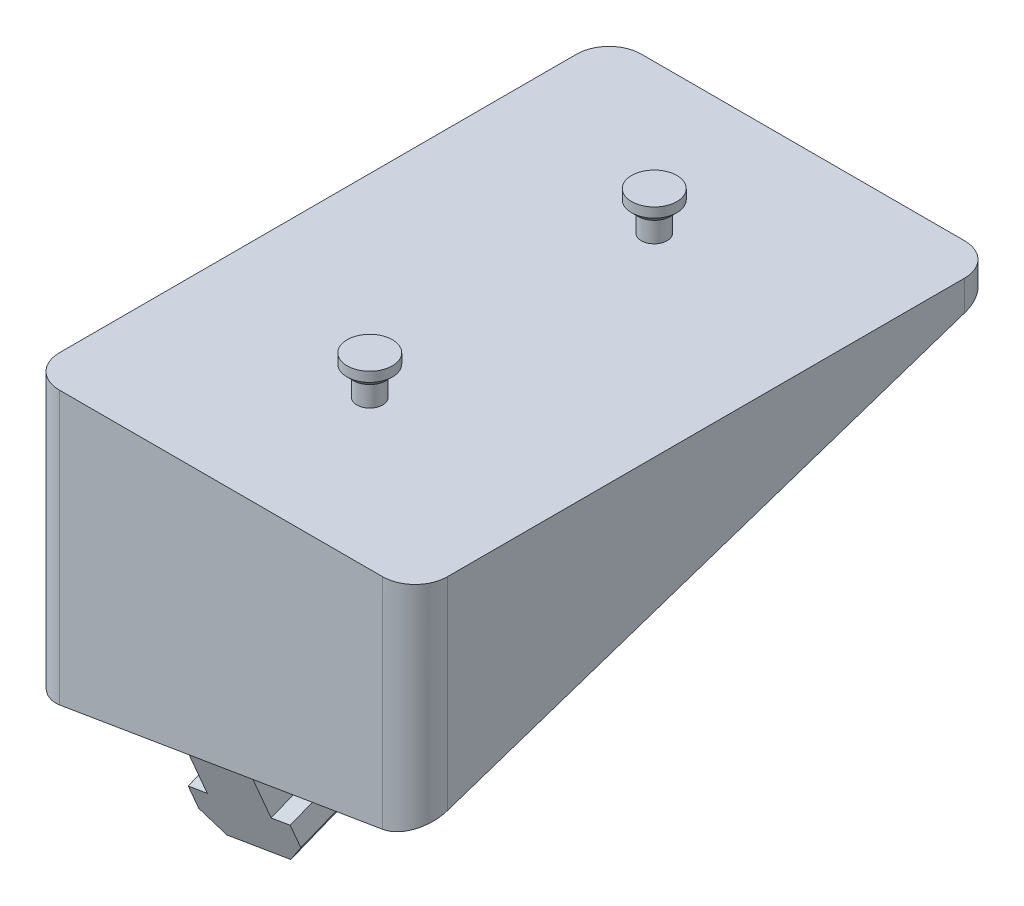
ISO-10303-21;
HEADER;
FILE_DESCRIPTION(('STEP AP214'),'2;1');
FILE_NAME('part.step','',(''),(''),'','','');
FILE_SCHEMA(('AUTOMOTIVE_DESIGN { 1 0 10303 214 1 1 1 1 }'));
ENDSEC;
DATA;
#1=APPLICATION_CONTEXT('core data for automotive mechanical design processes');
#2=APPLICATION_PROTOCOL_DEFINITION('international standard','automotive_design',2000,#1);
#3=PRODUCT_CONTEXT('',#1,'mechanical');
#4=PRODUCT('Part','Part','',(#3));
#5=PRODUCT_RELATED_PRODUCT_CATEGORY('part','',(#4));
#6=PRODUCT_DEFINITION_FORMATION('','',#4);
#7=PRODUCT_DEFINITION_CONTEXT('part definition',#1,'design');
#8=PRODUCT_DEFINITION('design','',#6,#7);
#9=PRODUCT_DEFINITION_SHAPE('','',#8);
#10=(LENGTH_UNIT() NAMED_UNIT(*) SI_UNIT(.MILLI.,.METRE.));
#11=(NAMED_UNIT(*) PLANE_ANGLE_UNIT() SI_UNIT($,.RADIAN.));
#12=(NAMED_UNIT(*) SI_UNIT($,.STERADIAN.) SOLID_ANGLE_UNIT());
#13=UNCERTAINTY_MEASURE_WITH_UNIT(LENGTH_MEASURE(1.E-05),#10,'distance_accuracy_value','');
#14=(GEOMETRIC_REPRESENTATION_CONTEXT(3) GLOBAL_UNCERTAINTY_ASSIGNED_CONTEXT((#13)) GLOBAL_UNIT_ASSIGNED_CONTEXT((#10,
#11,#12)) REPRESENTATION_CONTEXT('',''));
#15=CARTESIAN_POINT('',(0.,0.,0.));
#16=DIRECTION('',(0.,0.,1.));
#17=DIRECTION('',(1.,0.,0.));
#18=AXIS2_PLACEMENT_3D('',#15,#16,#17);
#19=CARTESIAN_POINT('',(1.75609756097561,-10.5365853658537,-3.51219512195122));
#20=DIRECTION('',(0.156173761888606,-0.937042571331637,-0.312347523777212));
#21=DIRECTION('',(0.,0.316227766016838,-0.948683298050514));
#22=AXIS2_PLACEMENT_3D('',#19,#20,#21);
#23=PLANE('',#22);
#24=DIRECTION('',(-0.986393923832144,-0.164398987305357,0.));
#25=VECTOR('',#24,1.);
#26=CARTESIAN_POINT('',(-19.7513920597356,-15.2918986766226,0.));
#27=LINE('',#26,#25);
#28=CARTESIAN_POINT('',(55.,-2.83333333333333,0.));
#29=VERTEX_POINT('',#28);
#30=CARTESIAN_POINT('',(30.0671047542959,-6.98881587428402,0.));
#31=VERTEX_POINT('',#30);
#32=EDGE_CURVE('E231',#29,#31,#27,.T.);
#33=ORIENTED_EDGE('',*,*,#32,.F.);
#34=CARTESIAN_POINT('',(55.,-4.49999999999999,5.));
#35=DIRECTION('',(0.156173761888606,-0.937042571331637,-0.312347523777212));
#36=DIRECTION('',(0.419058177461748,0.349215147884789,-0.838116354923493));
#37=AXIS2_PLACEMENT_3D('',#34,#35,#36);
#38=ELLIPSE('',#37,5.33593686452737,5.);
#39=CARTESIAN_POINT('',(60.,-3.66666666666665,5.));
#40=VERTEX_POINT('',#39);
#41=EDGE_CURVE('E313',#29,#40,#38,.T.);
#42=ORIENTED_EDGE('',*,*,#41,.T.);
#43=DIRECTION('',(0.,0.316227766016838,-0.948683298050514));
#44=VECTOR('',#43,1.);
#45=CARTESIAN_POINT('',(60.,-15.1800251035035,39.5400753105107));
#46=LINE('',#45,#44);
#47=CARTESIAN_POINT('',(60.,-30.3333333333333,85.));
#48=VERTEX_POINT('',#47);
#49=EDGE_CURVE('E227',#48,#40,#46,.T.);
#50=ORIENTED_EDGE('',*,*,#49,.F.);
#51=CARTESIAN_POINT('',(55.,-31.1666666666666,85.));
#52=DIRECTION('',(0.156173761888606,-0.937042571331637,-0.312347523777212));
#53=DIRECTION('',(0.419058177461748,0.349215147884789,-0.838116354923493));
#54=AXIS2_PLACEMENT_3D('',#51,#52,#53);
#55=ELLIPSE('',#54,5.33593686452737,5.);
#56=CARTESIAN_POINT('',(55.,-32.8333333333333,90.));
#57=VERTEX_POINT('',#56);
#58=EDGE_CURVE('E311',#48,#57,#55,.T.);
#59=ORIENTED_EDGE('',*,*,#58,.T.);
#60=DIRECTION('',(0.986393923832144,0.164398987305357,0.));
#61=VECTOR('',#60,1.);
#62=CARTESIAN_POINT('',(43.4918511835077,-34.751358136082,90.));
#63=LINE('',#62,#61);
#64=CARTESIAN_POINT('',(34.9319696191607,-36.1780050634732,90.));
#65=VERTEX_POINT('',#64);
#66=EDGE_CURVE('E224',#65,#57,#63,.T.);
#67=ORIENTED_EDGE('',*,*,#66,.F.);
#68=DIRECTION('',(0.0513496165963097,-0.308097699577858,0.949967907031729));
#69=VECTOR('',#68,1.);
#70=CARTESIAN_POINT('',(29.0069442191562,-0.627852663445901,-19.6129699000842));
#71=LINE('',#70,#69);
#72=EDGE_CURVE('E215',#31,#65,#71,.T.);
#73=ORIENTED_EDGE('',*,*,#72,.F.);
#74=EDGE_LOOP('',(#33,#42,#50,#59,#67,#73));
#75=FACE_BOUND('',#74,.T.);
#76=ADVANCED_FACE('F37',(#75),#23,.T.);
#77=CARTESIAN_POINT('',(0.,1.,0.));
#78=DIRECTION('',(0.,-1.,0.));
#79=DIRECTION('',(0.,0.,-1.));
#80=AXIS2_PLACEMENT_3D('',#77,#78,#79);
#81=PLANE('',#80);
#82=CARTESIAN_POINT('',(30.,1.,23.));
#83=DIRECTION('',(0.,-1.,0.));
#84=DIRECTION('',(0.,0.,-1.));
#85=AXIS2_PLACEMENT_3D('',#82,#83,#84);
#86=CIRCLE('',#85,2.);
#87=CARTESIAN_POINT('',(30.,1.,21.));
#88=VERTEX_POINT('',#87);
#89=EDGE_CURVE('E259',#88,#88,#86,.F.);
#90=ORIENTED_EDGE('',*,*,#89,.F.);
#91=EDGE_LOOP('',(#90));
#92=FACE_BOUND('',#91,.T.);
#93=DIRECTION('',(0.,0.,-1.));
#94=VECTOR('',#93,1.);
#95=CARTESIAN_POINT('',(60.,1.,0.));
#96=LINE('',#95,#94);
#97=CARTESIAN_POINT('',(60.,1.,85.));
#98=VERTEX_POINT('',#97);
#99=CARTESIAN_POINT('',(60.,1.,5.));
#100=VERTEX_POINT('',#99);
#101=EDGE_CURVE('E253',#98,#100,#96,.T.);
#102=ORIENTED_EDGE('',*,*,#101,.T.);
#103=CARTESIAN_POINT('',(55.,1.,5.));
#104=DIRECTION('',(0.,-1.,0.));
#105=DIRECTION('',(0.,0.,-1.));
#106=AXIS2_PLACEMENT_3D('',#103,#104,#105);
#107=CIRCLE('',#106,5.);
#108=CARTESIAN_POINT('',(55.,1.,0.));
#109=VERTEX_POINT('',#108);
#110=EDGE_CURVE('E304',#100,#109,#107,.F.);
#111=ORIENTED_EDGE('',*,*,#110,.T.);
#112=DIRECTION('',(-1.,0.,0.));
#113=VECTOR('',#112,1.);
#114=CARTESIAN_POINT('',(0.,1.,0.));
#115=LINE('',#114,#113);
#116=CARTESIAN_POINT('',(5.,1.,0.));
#117=VERTEX_POINT('',#116);
#118=EDGE_CURVE('E256',#109,#117,#115,.T.);
#119=ORIENTED_EDGE('',*,*,#118,.T.);
#120=CARTESIAN_POINT('',(5.,1.,5.));
#121=DIRECTION('',(0.,-1.,0.));
#122=DIRECTION('',(0.,0.,-1.));
#123=AXIS2_PLACEMENT_3D('',#120,#121,#122);
#124=CIRCLE('',#123,5.);
#125=CARTESIAN_POINT('',(0.,1.,5.00000000000003));
#126=VERTEX_POINT('',#125);
#127=EDGE_CURVE('E302',#117,#126,#124,.F.);
#128=ORIENTED_EDGE('',*,*,#127,.T.);
#129=DIRECTION('',(0.,0.,1.));
#130=VECTOR('',#129,1.);
#131=CARTESIAN_POINT('',(0.,1.,90.));
#132=LINE('',#131,#130);
#133=CARTESIAN_POINT('',(0.,1.,85.));
#134=VERTEX_POINT('',#133);
#135=EDGE_CURVE('E247',#126,#134,#132,.T.);
#136=ORIENTED_EDGE('',*,*,#135,.T.);
#137=CARTESIAN_POINT('',(5.00000000000002,1.,85.));
#138=DIRECTION('',(0.,-1.,0.));
#139=DIRECTION('',(0.,0.,-1.));
#140=AXIS2_PLACEMENT_3D('',#137,#138,#139);
#141=CIRCLE('',#140,5.);
#142=CARTESIAN_POINT('',(5.00000000000003,1.,90.));
#143=VERTEX_POINT('',#142);
#144=EDGE_CURVE('E298',#134,#143,#141,.F.);
#145=ORIENTED_EDGE('',*,*,#144,.T.);
#146=DIRECTION('',(1.,0.,0.));
#147=VECTOR('',#146,1.);
#148=CARTESIAN_POINT('',(60.,1.,90.));
#149=LINE('',#148,#147);
#150=CARTESIAN_POINT('',(55.,1.,90.));
#151=VERTEX_POINT('',#150);
#152=EDGE_CURVE('E250',#143,#151,#149,.T.);
#153=ORIENTED_EDGE('',*,*,#152,.T.);
#154=CARTESIAN_POINT('',(55.,1.,85.));
#155=DIRECTION('',(0.,-1.,0.));
#156=DIRECTION('',(0.,0.,-1.));
#157=AXIS2_PLACEMENT_3D('',#154,#155,#156);
#158=CIRCLE('',#157,5.);
#159=EDGE_CURVE('E300',#151,#98,#158,.F.);
#160=ORIENTED_EDGE('',*,*,#159,.T.);
#161=EDGE_LOOP('',(#102,#111,#119,#128,#136,#145,#153,#160));
#162=FACE_BOUND('',#161,.T.);
#163=CARTESIAN_POINT('',(30.,1.,67.));
#164=DIRECTION('',(0.,-1.,0.));
#165=DIRECTION('',(0.,0.,-1.));
#166=AXIS2_PLACEMENT_3D('',#163,#164,#165);
#167=CIRCLE('',#166,2.);
#168=CARTESIAN_POINT('',(30.,1.,65.));
#169=VERTEX_POINT('',#168);
#170=EDGE_CURVE('E262',#169,#169,#167,.F.);
#171=ORIENTED_EDGE('',*,*,#170,.F.);
#172=EDGE_LOOP('',(#171));
#173=FACE_BOUND('',#172,.T.);
#174=ADVANCED_FACE('F332',(#92,#162,#173),#81,.F.);
#175=CARTESIAN_POINT('',(0.,-1.99999999999999,90.));
#176=DIRECTION('',(-1.,0.,0.));
#177=DIRECTION('',(0.,0.,1.));
#178=AXIS2_PLACEMENT_3D('',#175,#176,#177);
#179=PLANE('',#178);
#180=ORIENTED_EDGE('',*,*,#135,.F.);
#181=DIRECTION('',(0.,1.,0.));
#182=VECTOR('',#181,1.);
#183=CARTESIAN_POINT('',(0.,-1.99999999999999,5.));
#184=LINE('',#183,#182);
#185=CARTESIAN_POINT('',(0.,-13.6666666666667,5.));
#186=VERTEX_POINT('',#185);
#187=EDGE_CURVE('E318',#126,#186,#184,.F.);
#188=ORIENTED_EDGE('',*,*,#187,.T.);
#189=DIRECTION('',(0.,-0.316227766016838,0.948683298050514));
#190=VECTOR('',#189,1.);
#191=CARTESIAN_POINT('',(0.,-51.1800251035035,117.540075310511));
#192=LINE('',#191,#190);
#193=CARTESIAN_POINT('',(0.,-40.3333333333333,85.));
#194=VERTEX_POINT('',#193);
#195=EDGE_CURVE('E228',#186,#194,#192,.T.);
#196=ORIENTED_EDGE('',*,*,#195,.T.);
#197=DIRECTION('',(0.,1.,0.));
#198=VECTOR('',#197,1.);
#199=CARTESIAN_POINT('',(0.,-1.99999999999999,85.));
#200=LINE('',#199,#198);
#201=EDGE_CURVE('E315',#194,#134,#200,.T.);
#202=ORIENTED_EDGE('',*,*,#201,.T.);
#203=EDGE_LOOP('',(#180,#188,#196,#202));
#204=FACE_BOUND('',#203,.T.);
#205=ADVANCED_FACE('F335',(#204),#179,.T.);
#206=CARTESIAN_POINT('',(0.,-1.99999999999999,0.));
#207=DIRECTION('',(0.,0.,-1.));
#208=DIRECTION('',(-1.,0.,0.));
#209=AXIS2_PLACEMENT_3D('',#206,#207,#208);
#210=PLANE('',#209);
#211=ORIENTED_EDGE('',*,*,#118,.F.);
#212=DIRECTION('',(0.,1.,0.));
#213=VECTOR('',#212,1.);
#214=CARTESIAN_POINT('',(55.,-1.99999999999999,0.));
#215=LINE('',#214,#213);
#216=EDGE_CURVE('E309',#109,#29,#215,.F.);
#217=ORIENTED_EDGE('',*,*,#216,.T.);
#218=ORIENTED_EDGE('',*,*,#32,.T.);
#219=DIRECTION('',(0.164398987305357,-0.986393923832144,0.));
#220=VECTOR('',#219,1.);
#221=CARTESIAN_POINT('',(27.2508466581806,9.90873270240776,0.));
#222=LINE('',#221,#220);
#223=CARTESIAN_POINT('',(31.1054492252309,-13.2188826998943,0.));
#224=VERTEX_POINT('',#223);
#225=EDGE_CURVE('E201',#31,#224,#222,.T.);
#226=ORIENTED_EDGE('',*,*,#225,.T.);
#227=DIRECTION('',(0.986393923832144,0.164398987305354,0.));
#228=VECTOR('',#227,1.);
#229=CARTESIAN_POINT('',(2.9842904168809,-17.9057425012859,0.));
#230=LINE('',#229,#228);
#231=CARTESIAN_POINT('',(34.0646309967274,-12.7256857379783,0.));
#232=VERTEX_POINT('',#231);
#233=EDGE_CURVE('E177',#224,#232,#230,.T.);
#234=ORIENTED_EDGE('',*,*,#233,.T.);
#235=DIRECTION('',(-0.164398987305355,0.986393923832144,0.));
#236=VECTOR('',#235,1.);
#237=CARTESIAN_POINT('',(30.2100284296771,10.4019296643238,0.));
#238=LINE('',#237,#236);
#239=CARTESIAN_POINT('',(34.6703319381061,-16.359891386251,0.));
#240=VERTEX_POINT('',#239);
#241=EDGE_CURVE('E205',#240,#232,#238,.T.);
#242=ORIENTED_EDGE('',*,*,#241,.F.);
#243=DIRECTION('',(0.560175137739287,0.828374199899279,0.));
#244=VECTOR('',#243,1.);
#245=CARTESIAN_POINT('',(30.4544009534871,-22.5943138390372,0.));
#246=LINE('',#245,#244);
#247=CARTESIAN_POINT('',(32.2303224020773,-19.9681217609722,0.));
#248=VERTEX_POINT('',#247);
#249=EDGE_CURVE('E289',#240,#248,#246,.F.);
#250=ORIENTED_EDGE('',*,*,#249,.T.);
#251=DIRECTION('',(0.986393923832144,0.164398987305358,0.));
#252=VECTOR('',#251,1.);
#253=CARTESIAN_POINT('',(4.10916359372734,-24.6549815623639,0.));
#254=LINE('',#253,#252);
#255=CARTESIAN_POINT('',(22.3663831637558,-21.6121116340258,0.));
#256=VERTEX_POINT('',#255);
#257=EDGE_CURVE('E208',#256,#248,#254,.T.);
#258=ORIENTED_EDGE('',*,*,#257,.F.);
#259=DIRECTION('',(-0.79855730323423,0.601918793070356,0.));
#260=VECTOR('',#259,1.);
#261=CARTESIAN_POINT('',(-1.32340792248378,-3.75574691108528,0.));
#262=LINE('',#261,#260);
#263=CARTESIAN_POINT('',(18.8880291567918,-18.9902751831367,0.));
#264=VERTEX_POINT('',#263);
#265=EDGE_CURVE('E172',#256,#264,#262,.T.);
#266=ORIENTED_EDGE('',*,*,#265,.T.);
#267=DIRECTION('',(-0.164398987305359,0.986393923832143,0.));
#268=VECTOR('',#267,1.);
#269=CARTESIAN_POINT('',(14.4277256483626,7.77154586743815,0.));
#270=LINE('',#269,#268);
#271=CARTESIAN_POINT('',(18.2823282154131,-15.356069534864,0.));
#272=VERTEX_POINT('',#271);
#273=EDGE_CURVE('E162',#264,#272,#270,.T.);
#274=ORIENTED_EDGE('',*,*,#273,.T.);
#275=DIRECTION('',(-0.986393923832143,-0.164398987305361,0.));
#276=VECTOR('',#275,1.);
#277=CARTESIAN_POINT('',(2.9842904168811,-17.9057425012861,0.));
#278=LINE('',#277,#276);
#279=CARTESIAN_POINT('',(21.2415099869095,-14.8628725729479,0.));
#280=VERTEX_POINT('',#279);
#281=EDGE_CURVE('E168',#280,#272,#278,.T.);
#282=ORIENTED_EDGE('',*,*,#281,.F.);
#283=DIRECTION('',(0.164398987305358,-0.986393923832144,0.));
#284=VECTOR('',#283,1.);
#285=CARTESIAN_POINT('',(17.3869074198591,8.26474282935419,0.));
#286=LINE('',#285,#284);
#287=CARTESIAN_POINT('',(20.2031655159744,-8.6328057473376,0.));
#288=VERTEX_POINT('',#287);
#289=EDGE_CURVE('E198',#288,#280,#286,.T.);
#290=ORIENTED_EDGE('',*,*,#289,.F.);
#291=CARTESIAN_POINT('',(5.,-11.1666666666667,0.));
#292=VERTEX_POINT('',#291);
#293=EDGE_CURVE('E233',#288,#292,#27,.T.);
#294=ORIENTED_EDGE('',*,*,#293,.T.);
#295=DIRECTION('',(0.,1.,0.));
#296=VECTOR('',#295,1.);
#297=CARTESIAN_POINT('',(5.,-1.99999999999999,0.));
#298=LINE('',#297,#296);
#299=EDGE_CURVE('E306',#292,#117,#298,.T.);
#300=ORIENTED_EDGE('',*,*,#299,.T.);
#301=EDGE_LOOP('',(#211,#217,#218,#226,#234,#242,#250,#258,#266,#274,#282,#290,#294,#300));
#302=FACE_BOUND('',#301,.T.);
#303=ADVANCED_FACE('F165',(#302),#210,.T.);
#304=CARTESIAN_POINT('',(60.,-1.99999999999999,0.));
#305=DIRECTION('',(1.,0.,0.));
#306=DIRECTION('',(0.,0.,-1.));
#307=AXIS2_PLACEMENT_3D('',#304,#305,#306);
#308=PLANE('',#307);
#309=ORIENTED_EDGE('',*,*,#49,.T.);
#310=DIRECTION('',(0.,1.,0.));
#311=VECTOR('',#310,1.);
#312=CARTESIAN_POINT('',(60.,-1.99999999999999,5.));
#313=LINE('',#312,#311);
#314=EDGE_CURVE('E295',#40,#100,#313,.T.);
#315=ORIENTED_EDGE('',*,*,#314,.T.);
#316=ORIENTED_EDGE('',*,*,#101,.F.);
#317=DIRECTION('',(0.,1.,0.));
#318=VECTOR('',#317,1.);
#319=CARTESIAN_POINT('',(60.,-1.99999999999999,85.));
#320=LINE('',#319,#318);
#321=EDGE_CURVE('E293',#98,#48,#320,.F.);
#322=ORIENTED_EDGE('',*,*,#321,.T.);
#323=EDGE_LOOP('',(#309,#315,#316,#322));
#324=FACE_BOUND('',#323,.T.);
#325=ADVANCED_FACE('F348',(#324),#308,.T.);
#326=CARTESIAN_POINT('',(60.,-1.99999999999999,90.));
#327=DIRECTION('',(0.,0.,1.));
#328=DIRECTION('',(1.,0.,0.));
#329=AXIS2_PLACEMENT_3D('',#326,#327,#328);
#330=PLANE('',#329);
#331=ORIENTED_EDGE('',*,*,#66,.T.);
#332=DIRECTION('',(0.,1.,0.));
#333=VECTOR('',#332,1.);
#334=CARTESIAN_POINT('',(55.,-1.99999999999999,90.));
#335=LINE('',#334,#333);
#336=EDGE_CURVE('E11',#57,#151,#335,.T.);
#337=ORIENTED_EDGE('',*,*,#336,.T.);
#338=ORIENTED_EDGE('',*,*,#152,.F.);
#339=DIRECTION('',(0.,1.,0.));
#340=VECTOR('',#339,1.);
#341=CARTESIAN_POINT('',(5.00000000000002,-1.99999999999999,90.));
#342=LINE('',#341,#340);
#343=CARTESIAN_POINT('',(5.00000000000002,-41.1666666666666,90.));
#344=VERTEX_POINT('',#343);
#345=EDGE_CURVE('E45',#143,#344,#342,.F.);
#346=ORIENTED_EDGE('',*,*,#345,.T.);
#347=CARTESIAN_POINT('',(25.0680303808393,-37.8219949365268,90.));
#348=VERTEX_POINT('',#347);
#349=EDGE_CURVE('E225',#344,#348,#63,.T.);
#350=ORIENTED_EDGE('',*,*,#349,.T.);
#351=DIRECTION('',(0.986393923832144,0.164398987305358,0.));
#352=VECTOR('',#351,1.);
#353=CARTESIAN_POINT('',(6.81081081081083,-40.8648648648649,90.));
#354=LINE('',#353,#352);
#355=EDGE_CURVE('E200',#348,#65,#354,.T.);
#356=ORIENTED_EDGE('',*,*,#355,.T.);
#357=EDGE_LOOP('',(#331,#337,#338,#346,#350,#356));
#358=FACE_BOUND('',#357,.T.);
#359=ADVANCED_FACE('F339',(#358),#330,.T.);
#360=CARTESIAN_POINT('',(30.,4.5,23.));
#361=DIRECTION('',(0.,-1.,0.));
#362=DIRECTION('',(0.,0.,-1.));
#363=AXIS2_PLACEMENT_3D('',#360,#361,#362);
#364=CYLINDRICAL_SURFACE('',#363,2.);
#365=CARTESIAN_POINT('',(30.,4.5,23.));
#366=DIRECTION('',(0.,1.,0.));
#367=DIRECTION('',(0.,0.,1.));
#368=AXIS2_PLACEMENT_3D('',#365,#366,#367);
#369=CIRCLE('',#368,2.);
#370=CARTESIAN_POINT('',(30.,4.5,21.));
#371=VERTEX_POINT('',#370);
#372=EDGE_CURVE('E244',#371,#371,#369,.T.);
#373=CARTESIAN_POINT('',(30.,4.5,21.));
#374=CARTESIAN_POINT('',(30.,4.46354166666667,21.));
#375=CARTESIAN_POINT('',(30.,4.42708333333333,21.));
#376=CARTESIAN_POINT('',(30.,4.35416666666667,21.));
#377=CARTESIAN_POINT('',(30.,4.31770833333333,21.));
#378=CARTESIAN_POINT('',(30.,4.24479166666667,21.));
#379=CARTESIAN_POINT('',(30.,4.20833333333333,21.));
#380=CARTESIAN_POINT('',(30.,4.13541666666667,21.));
#381=CARTESIAN_POINT('',(30.,4.09895833333333,21.));
#382=CARTESIAN_POINT('',(30.,4.02604166666667,21.));
#383=CARTESIAN_POINT('',(30.,3.98958333333333,21.));
#384=CARTESIAN_POINT('',(30.,3.91666666666667,21.));
#385=CARTESIAN_POINT('',(30.,3.88020833333333,21.));
#386=CARTESIAN_POINT('',(30.,3.80729166666667,21.));
#387=CARTESIAN_POINT('',(30.,3.77083333333333,21.));
#388=CARTESIAN_POINT('',(30.,3.69791666666667,21.));
#389=CARTESIAN_POINT('',(30.,3.66145833333333,21.));
#390=CARTESIAN_POINT('',(30.,3.58854166666667,21.));
#391=CARTESIAN_POINT('',(30.,3.55208333333333,21.));
#392=CARTESIAN_POINT('',(30.,3.47916666666667,21.));
#393=CARTESIAN_POINT('',(30.,3.44270833333333,21.));
#394=CARTESIAN_POINT('',(30.,3.36979166666667,21.));
#395=CARTESIAN_POINT('',(30.,3.33333333333333,21.));
#396=CARTESIAN_POINT('',(30.,3.26041666666667,21.));
#397=CARTESIAN_POINT('',(30.,3.22395833333333,21.));
#398=CARTESIAN_POINT('',(30.,3.15104166666667,21.));
#399=CARTESIAN_POINT('',(30.,3.11458333333333,21.));
#400=CARTESIAN_POINT('',(30.,3.04166666666667,21.));
#401=CARTESIAN_POINT('',(30.,3.00520833333333,21.));
#402=CARTESIAN_POINT('',(30.,2.93229166666667,21.));
#403=CARTESIAN_POINT('',(30.,2.89583333333333,21.));
#404=CARTESIAN_POINT('',(30.,2.82291666666667,21.));
#405=CARTESIAN_POINT('',(30.,2.78645833333333,21.));
#406=CARTESIAN_POINT('',(30.,2.71354166666667,21.));
#407=CARTESIAN_POINT('',(30.,2.67708333333333,21.));
#408=CARTESIAN_POINT('',(30.,2.60416666666667,21.));
#409=CARTESIAN_POINT('',(30.,2.56770833333333,21.));
#410=CARTESIAN_POINT('',(30.,2.49479166666667,21.));
#411=CARTESIAN_POINT('',(30.,2.45833333333333,21.));
#412=CARTESIAN_POINT('',(30.,2.38541666666667,21.));
#413=CARTESIAN_POINT('',(30.,2.34895833333333,21.));
#414=CARTESIAN_POINT('',(30.,2.27604166666667,21.));
#415=CARTESIAN_POINT('',(30.,2.23958333333333,21.));
#416=CARTESIAN_POINT('',(30.,2.16666666666667,21.));
#417=CARTESIAN_POINT('',(30.,2.13020833333333,21.));
#418=CARTESIAN_POINT('',(30.,2.05729166666667,21.));
#419=CARTESIAN_POINT('',(30.,2.02083333333333,21.));
#420=CARTESIAN_POINT('',(30.,1.94791666666667,21.));
#421=CARTESIAN_POINT('',(30.,1.91145833333333,21.));
#422=CARTESIAN_POINT('',(30.,1.83854166666667,21.));
#423=CARTESIAN_POINT('',(30.,1.80208333333333,21.));
#424=CARTESIAN_POINT('',(30.,1.72916666666667,21.));
#425=CARTESIAN_POINT('',(30.,1.69270833333333,21.));
#426=CARTESIAN_POINT('',(30.,1.61979166666667,21.));
#427=CARTESIAN_POINT('',(30.,1.58333333333333,21.));
#428=CARTESIAN_POINT('',(30.,1.51041666666667,21.));
#429=CARTESIAN_POINT('',(30.,1.47395833333333,21.));
#430=CARTESIAN_POINT('',(30.,1.40104166666667,21.));
#431=CARTESIAN_POINT('',(30.,1.36458333333333,21.));
#432=CARTESIAN_POINT('',(30.,1.29166666666667,21.));
#433=CARTESIAN_POINT('',(30.,1.25520833333333,21.));
#434=CARTESIAN_POINT('',(30.,1.18229166666667,21.));
#435=CARTESIAN_POINT('',(30.,1.14583333333333,21.));
#436=CARTESIAN_POINT('',(30.,1.07291666666667,21.));
#437=CARTESIAN_POINT('',(30.,1.03645833333333,21.));
#438=CARTESIAN_POINT('',(30.,1.,21.));
#439=B_SPLINE_CURVE_WITH_KNOTS('',3,(#373,#374,#375,#376,#377,#378,#379,#380,#381,#382,#383,
#384,#385,#386,#387,#388,#389,#390,#391,#392,#393,#394,#395,#396,#397,#398,#399,#400,#401,#402,
#403,#404,#405,#406,#407,#408,#409,#410,#411,#412,#413,#414,#415,#416,#417,#418,#419,#420,#421,
#422,#423,#424,#425,#426,#427,#428,#429,#430,#431,#432,#433,#434,#435,#436,#437,#438),
.UNSPECIFIED.,.F.,.F.,(4,2,2,2,2,2,2,2,2,2,2,2,2,2,2,2,2,2,2,2,2,2,2,2,2,2,2,2,2,2,2,2,4),(0.,
0.109375,0.21875,0.328125,0.4375,0.546875,0.65625,0.765625,0.875,0.984375,1.09375,1.203125,
1.3125,1.421875,1.53125,1.640625,1.75,1.859375,1.96875,2.078125,2.1875,2.296875,2.40625,
2.515625,2.625,2.734375,2.84375,2.953125,3.0625,3.171875,3.28125,3.390625,3.5),.UNSPECIFIED.);
#440=EDGE_CURVE('BSEAM478',#371,#88,#439,.T.);
#441=ORIENTED_EDGE('',*,*,#372,.F.);
#442=ORIENTED_EDGE('',*,*,#89,.T.);
#443=ORIENTED_EDGE('',*,*,#440,.T.);
#444=ORIENTED_EDGE('',*,*,#440,.F.);
#445=EDGE_LOOP('',(#441,#443,#442,#444));
#446=FACE_BOUND('',#445,.T.);
#447=ADVANCED_FACE('F478',(#446),#364,.T.);
#448=CARTESIAN_POINT('',(30.,4.5,67.));
#449=DIRECTION('',(0.,-1.,0.));
#450=DIRECTION('',(0.,0.,-1.));
#451=AXIS2_PLACEMENT_3D('',#448,#449,#450);
#452=CYLINDRICAL_SURFACE('',#451,2.);
#453=CARTESIAN_POINT('',(30.,4.5,67.));
#454=DIRECTION('',(0.,1.,0.));
#455=DIRECTION('',(0.,0.,1.));
#456=AXIS2_PLACEMENT_3D('',#453,#454,#455);
#457=CIRCLE('',#456,2.);
#458=CARTESIAN_POINT('',(30.,4.5,65.));
#459=VERTEX_POINT('',#458);
#460=EDGE_CURVE('E241',#459,#459,#457,.T.);
#461=CARTESIAN_POINT('',(30.,4.5,65.));
#462=CARTESIAN_POINT('',(30.,4.46354166666667,65.));
#463=CARTESIAN_POINT('',(30.,4.42708333333333,65.));
#464=CARTESIAN_POINT('',(30.,4.35416666666667,65.));
#465=CARTESIAN_POINT('',(30.,4.31770833333333,65.));
#466=CARTESIAN_POINT('',(30.,4.24479166666667,65.));
#467=CARTESIAN_POINT('',(30.,4.20833333333333,65.));
#468=CARTESIAN_POINT('',(30.,4.13541666666667,65.));
#469=CARTESIAN_POINT('',(30.,4.09895833333333,65.));
#470=CARTESIAN_POINT('',(30.,4.02604166666667,65.));
#471=CARTESIAN_POINT('',(30.,3.98958333333333,65.));
#472=CARTESIAN_POINT('',(30.,3.91666666666667,65.));
#473=CARTESIAN_POINT('',(30.,3.88020833333333,65.));
#474=CARTESIAN_POINT('',(30.,3.80729166666667,65.));
#475=CARTESIAN_POINT('',(30.,3.77083333333333,65.));
#476=CARTESIAN_POINT('',(30.,3.69791666666667,65.));
#477=CARTESIAN_POINT('',(30.,3.66145833333333,65.));
#478=CARTESIAN_POINT('',(30.,3.58854166666667,65.));
#479=CARTESIAN_POINT('',(30.,3.55208333333333,65.));
#480=CARTESIAN_POINT('',(30.,3.47916666666667,65.));
#481=CARTESIAN_POINT('',(30.,3.44270833333333,65.));
#482=CARTESIAN_POINT('',(30.,3.36979166666667,65.));
#483=CARTESIAN_POINT('',(30.,3.33333333333333,65.));
#484=CARTESIAN_POINT('',(30.,3.26041666666667,65.));
#485=CARTESIAN_POINT('',(30.,3.22395833333333,65.));
#486=CARTESIAN_POINT('',(30.,3.15104166666667,65.));
#487=CARTESIAN_POINT('',(30.,3.11458333333333,65.));
#488=CARTESIAN_POINT('',(30.,3.04166666666667,65.));
#489=CARTESIAN_POINT('',(30.,3.00520833333333,65.));
#490=CARTESIAN_POINT('',(30.,2.93229166666667,65.));
#491=CARTESIAN_POINT('',(30.,2.89583333333333,65.));
#492=CARTESIAN_POINT('',(30.,2.82291666666667,65.));
#493=CARTESIAN_POINT('',(30.,2.78645833333333,65.));
#494=CARTESIAN_POINT('',(30.,2.71354166666667,65.));
#495=CARTESIAN_POINT('',(30.,2.67708333333333,65.));
#496=CARTESIAN_POINT('',(30.,2.60416666666667,65.));
#497=CARTESIAN_POINT('',(30.,2.56770833333333,65.));
#498=CARTESIAN_POINT('',(30.,2.49479166666667,65.));
#499=CARTESIAN_POINT('',(30.,2.45833333333333,65.));
#500=CARTESIAN_POINT('',(30.,2.38541666666667,65.));
#501=CARTESIAN_POINT('',(30.,2.34895833333333,65.));
#502=CARTESIAN_POINT('',(30.,2.27604166666667,65.));
#503=CARTESIAN_POINT('',(30.,2.23958333333333,65.));
#504=CARTESIAN_POINT('',(30.,2.16666666666667,65.));
#505=CARTESIAN_POINT('',(30.,2.13020833333333,65.));
#506=CARTESIAN_POINT('',(30.,2.05729166666667,65.));
#507=CARTESIAN_POINT('',(30.,2.02083333333333,65.));
#508=CARTESIAN_POINT('',(30.,1.94791666666667,65.));
#509=CARTESIAN_POINT('',(30.,1.91145833333333,65.));
#510=CARTESIAN_POINT('',(30.,1.83854166666667,65.));
#511=CARTESIAN_POINT('',(30.,1.80208333333333,65.));
#512=CARTESIAN_POINT('',(30.,1.72916666666667,65.));
#513=CARTESIAN_POINT('',(30.,1.69270833333333,65.));
#514=CARTESIAN_POINT('',(30.,1.61979166666667,65.));
#515=CARTESIAN_POINT('',(30.,1.58333333333333,65.));
#516=CARTESIAN_POINT('',(30.,1.51041666666667,65.));
#517=CARTESIAN_POINT('',(30.,1.47395833333333,65.));
#518=CARTESIAN_POINT('',(30.,1.40104166666667,65.));
#519=CARTESIAN_POINT('',(30.,1.36458333333333,65.));
#520=CARTESIAN_POINT('',(30.,1.29166666666667,65.));
#521=CARTESIAN_POINT('',(30.,1.25520833333333,65.));
#522=CARTESIAN_POINT('',(30.,1.18229166666667,65.));
#523=CARTESIAN_POINT('',(30.,1.14583333333333,65.));
#524=CARTESIAN_POINT('',(30.,1.07291666666667,65.));
#525=CARTESIAN_POINT('',(30.,1.03645833333333,65.));
#526=CARTESIAN_POINT('',(30.,1.,65.));
#527=B_SPLINE_CURVE_WITH_KNOTS('',3,(#461,#462,#463,#464,#465,#466,#467,#468,#469,#470,#471,
#472,#473,#474,#475,#476,#477,#478,#479,#480,#481,#482,#483,#484,#485,#486,#487,#488,#489,#490,
#491,#492,#493,#494,#495,#496,#497,#498,#499,#500,#501,#502,#503,#504,#505,#506,#507,#508,#509,
#510,#511,#512,#513,#514,#515,#516,#517,#518,#519,#520,#521,#522,#523,#524,#525,#526),
.UNSPECIFIED.,.F.,.F.,(4,2,2,2,2,2,2,2,2,2,2,2,2,2,2,2,2,2,2,2,2,2,2,2,2,2,2,2,2,2,2,2,4),(0.,
0.109375,0.21875,0.328125,0.4375,0.546875,0.65625,0.765625,0.875,0.984375,1.09375,1.203125,
1.3125,1.421875,1.53125,1.640625,1.75,1.859375,1.96875,2.078125,2.1875,2.296875,2.40625,
2.515625,2.625,2.734375,2.84375,2.953125,3.0625,3.171875,3.28125,3.390625,3.5),.UNSPECIFIED.);
#528=EDGE_CURVE('BSEAM638',#459,#169,#527,.T.);
#529=ORIENTED_EDGE('',*,*,#460,.F.);
#530=ORIENTED_EDGE('',*,*,#170,.T.);
#531=ORIENTED_EDGE('',*,*,#528,.T.);
#532=ORIENTED_EDGE('',*,*,#528,.F.);
#533=EDGE_LOOP('',(#529,#531,#530,#532));
#534=FACE_BOUND('',#533,.T.);
#535=ADVANCED_FACE('F638',(#534),#452,.T.);
#536=CARTESIAN_POINT('',(30.,4.5,23.));
#537=DIRECTION('',(0.,1.,0.));
#538=DIRECTION('',(0.,0.,1.));
#539=AXIS2_PLACEMENT_3D('',#536,#537,#538);
#540=PLANE('',#539);
#541=CARTESIAN_POINT('',(30.,4.5,23.));
#542=DIRECTION('',(0.,1.,0.));
#543=DIRECTION('',(0.,0.,1.));
#544=AXIS2_PLACEMENT_3D('',#541,#542,#543);
#545=CIRCLE('',#544,2.5);
#546=CARTESIAN_POINT('',(30.,4.5,25.5));
#547=VERTEX_POINT('',#546);
#548=EDGE_CURVE('E268',#547,#547,#545,.F.);
#549=ORIENTED_EDGE('',*,*,#548,.T.);
#550=EDGE_LOOP('',(#549));
#551=FACE_BOUND('',#550,.T.);
#552=ORIENTED_EDGE('',*,*,#372,.T.);
#553=EDGE_LOOP('',(#552));
#554=FACE_BOUND('',#553,.T.);
#555=ADVANCED_FACE('F628',(#551,#554),#540,.F.);
#556=CARTESIAN_POINT('',(30.,7.,23.));
#557=DIRECTION('',(0.,-1.,0.));
#558=DIRECTION('',(0.,0.,-1.));
#559=AXIS2_PLACEMENT_3D('',#556,#557,#558);
#560=CYLINDRICAL_SURFACE('',#559,3.5);
#561=CARTESIAN_POINT('',(30.,5.5,23.));
#562=DIRECTION('',(0.,1.,0.));
#563=DIRECTION('',(0.,0.,1.));
#564=AXIS2_PLACEMENT_3D('',#561,#562,#563);
#565=CIRCLE('',#564,3.5);
#566=CARTESIAN_POINT('',(30.,5.5,26.5));
#567=VERTEX_POINT('',#566);
#568=EDGE_CURVE('E265',#567,#567,#565,.T.);
#569=ORIENTED_EDGE('',*,*,#568,.T.);
#570=EDGE_LOOP('',(#569));
#571=FACE_BOUND('',#570,.T.);
#572=CARTESIAN_POINT('',(30.,7.,23.));
#573=DIRECTION('',(0.,1.,0.));
#574=DIRECTION('',(0.,0.,1.));
#575=AXIS2_PLACEMENT_3D('',#572,#573,#574);
#576=CIRCLE('',#575,3.5);
#577=CARTESIAN_POINT('',(30.,7.,26.5));
#578=VERTEX_POINT('',#577);
#579=EDGE_CURVE('E238',#578,#578,#576,.T.);
#580=ORIENTED_EDGE('',*,*,#579,.F.);
#581=EDGE_LOOP('',(#580));
#582=FACE_BOUND('',#581,.T.);
#583=ADVANCED_FACE('F623',(#571,#582),#560,.T.);
#584=CARTESIAN_POINT('',(30.,7.,23.));
#585=DIRECTION('',(0.,1.,0.));
#586=DIRECTION('',(0.,0.,1.));
#587=AXIS2_PLACEMENT_3D('',#584,#585,#586);
#588=PLANE('',#587);
#589=ORIENTED_EDGE('',*,*,#579,.T.);
#590=EDGE_LOOP('',(#589));
#591=FACE_BOUND('',#590,.T.);
#592=ADVANCED_FACE('F615',(#591),#588,.T.);
#593=CARTESIAN_POINT('',(30.,4.5,67.));
#594=DIRECTION('',(0.,1.,0.));
#595=DIRECTION('',(0.,0.,1.));
#596=AXIS2_PLACEMENT_3D('',#593,#594,#595);
#597=PLANE('',#596);
#598=CARTESIAN_POINT('',(30.,4.5,67.));
#599=DIRECTION('',(0.,1.,0.));
#600=DIRECTION('',(0.,0.,1.));
#601=AXIS2_PLACEMENT_3D('',#598,#599,#600);
#602=CIRCLE('',#601,2.5);
#603=CARTESIAN_POINT('',(30.,4.5,69.5));
#604=VERTEX_POINT('',#603);
#605=EDGE_CURVE('E274',#604,#604,#602,.F.);
#606=ORIENTED_EDGE('',*,*,#605,.T.);
#607=EDGE_LOOP('',(#606));
#608=FACE_BOUND('',#607,.T.);
#609=ORIENTED_EDGE('',*,*,#460,.T.);
#610=EDGE_LOOP('',(#609));
#611=FACE_BOUND('',#610,.T.);
#612=ADVANCED_FACE('F605',(#608,#611),#597,.F.);
#613=CARTESIAN_POINT('',(30.,7.,67.));
#614=DIRECTION('',(0.,-1.,0.));
#615=DIRECTION('',(0.,0.,-1.));
#616=AXIS2_PLACEMENT_3D('',#613,#614,#615);
#617=CYLINDRICAL_SURFACE('',#616,3.5);
#618=CARTESIAN_POINT('',(30.,5.5,67.));
#619=DIRECTION('',(0.,1.,0.));
#620=DIRECTION('',(0.,0.,1.));
#621=AXIS2_PLACEMENT_3D('',#618,#619,#620);
#622=CIRCLE('',#621,3.5);
#623=CARTESIAN_POINT('',(30.,5.5,70.5));
#624=VERTEX_POINT('',#623);
#625=EDGE_CURVE('E271',#624,#624,#622,.T.);
#626=ORIENTED_EDGE('',*,*,#625,.T.);
#627=EDGE_LOOP('',(#626));
#628=FACE_BOUND('',#627,.T.);
#629=CARTESIAN_POINT('',(30.,7.,67.));
#630=DIRECTION('',(0.,1.,0.));
#631=DIRECTION('',(0.,0.,1.));
#632=AXIS2_PLACEMENT_3D('',#629,#630,#631);
#633=CIRCLE('',#632,3.5);
#634=CARTESIAN_POINT('',(30.,7.,70.5));
#635=VERTEX_POINT('',#634);
#636=EDGE_CURVE('E230',#635,#635,#633,.T.);
#637=ORIENTED_EDGE('',*,*,#636,.F.);
#638=EDGE_LOOP('',(#637));
#639=FACE_BOUND('',#638,.T.);
#640=ADVANCED_FACE('F600',(#628,#639),#617,.T.);
#641=CARTESIAN_POINT('',(30.,7.,67.));
#642=DIRECTION('',(0.,1.,0.));
#643=DIRECTION('',(0.,0.,1.));
#644=AXIS2_PLACEMENT_3D('',#641,#642,#643);
#645=PLANE('',#644);
#646=ORIENTED_EDGE('',*,*,#636,.T.);
#647=EDGE_LOOP('',(#646));
#648=FACE_BOUND('',#647,.T.);
#649=ADVANCED_FACE('F429',(#648),#645,.T.);
#650=CARTESIAN_POINT('',(30.,5.5,23.));
#651=DIRECTION('',(0.,1.,0.));
#652=DIRECTION('',(0.,0.,1.));
#653=AXIS2_PLACEMENT_3D('',#650,#651,#652);
#654=CONICAL_SURFACE('',#653,3.5,0.785398163397447);
#655=ORIENTED_EDGE('',*,*,#548,.F.);
#656=EDGE_LOOP('',(#655));
#657=FACE_BOUND('',#656,.T.);
#658=ORIENTED_EDGE('',*,*,#568,.F.);
#659=EDGE_LOOP('',(#658));
#660=FACE_BOUND('',#659,.T.);
#661=ADVANCED_FACE('F423',(#657,#660),#654,.T.);
#662=CARTESIAN_POINT('',(30.,5.5,67.));
#663=DIRECTION('',(0.,1.,0.));
#664=DIRECTION('',(0.,0.,1.));
#665=AXIS2_PLACEMENT_3D('',#662,#663,#664);
#666=CONICAL_SURFACE('',#665,3.5,0.785398163397448);
#667=ORIENTED_EDGE('',*,*,#605,.F.);
#668=EDGE_LOOP('',(#667));
#669=FACE_BOUND('',#668,.T.);
#670=ORIENTED_EDGE('',*,*,#625,.F.);
#671=EDGE_LOOP('',(#670));
#672=FACE_BOUND('',#671,.T.);
#673=ADVANCED_FACE('F418',(#669,#672),#666,.T.);
#674=ORIENTED_EDGE('',*,*,#195,.F.);
#675=CARTESIAN_POINT('',(5.,-12.8333333333333,5.));
#676=DIRECTION('',(0.156173761888606,-0.937042571331637,-0.312347523777212));
#677=DIRECTION('',(0.419058177461748,0.349215147884789,-0.838116354923493));
#678=AXIS2_PLACEMENT_3D('',#675,#676,#677);
#679=ELLIPSE('',#678,5.33593686452737,5.);
#680=EDGE_CURVE('E321',#186,#292,#679,.T.);
#681=ORIENTED_EDGE('',*,*,#680,.T.);
#682=ORIENTED_EDGE('',*,*,#293,.F.);
#683=DIRECTION('',(0.0513496165963097,-0.308097699577858,0.949967907031729));
#684=VECTOR('',#683,1.);
#685=CARTESIAN_POINT('',(19.1430049808347,-2.27184253649949,-19.6129699000842));
#686=LINE('',#685,#684);
#687=EDGE_CURVE('E211',#288,#348,#686,.T.);
#688=ORIENTED_EDGE('',*,*,#687,.T.);
#689=ORIENTED_EDGE('',*,*,#349,.F.);
#690=CARTESIAN_POINT('',(5.00000000000002,-39.5,85.));
#691=DIRECTION('',(0.156173761888606,-0.937042571331637,-0.312347523777212));
#692=DIRECTION('',(0.419058177461748,0.349215147884789,-0.838116354923493));
#693=AXIS2_PLACEMENT_3D('',#690,#691,#692);
#694=ELLIPSE('',#693,5.33593686452737,5.);
#695=EDGE_CURVE('E58',#344,#194,#694,.T.);
#696=ORIENTED_EDGE('',*,*,#695,.T.);
#697=EDGE_LOOP('',(#674,#681,#682,#688,#689,#696));
#698=FACE_BOUND('',#697,.T.);
#699=ADVANCED_FACE('F324',(#698),#23,.T.);
#700=CARTESIAN_POINT('',(5.05471324983521,-30.3282794990112,93.5121951219513));
#701=DIRECTION('',(-0.0513496165963098,0.308097699577858,-0.949967907031729));
#702=DIRECTION('',(0.,0.951222818948763,0.308504698037436));
#703=AXIS2_PLACEMENT_3D('',#700,#701,#702);
#704=PLANE('',#703);
#705=DIRECTION('',(0.986393923832144,0.164398987305358,0.));
#706=VECTOR('',#705,1.);
#707=CARTESIAN_POINT('',(8.76298283441841,-52.5778970065103,86.0956559527849));
#708=LINE('',#707,#706);
#709=CARTESIAN_POINT('',(27.0202024044469,-49.5350270781722,86.0956559527849));
#710=VERTEX_POINT('',#709);
#711=CARTESIAN_POINT('',(36.8841416427683,-47.8910372051186,86.0956559527849));
#712=VERTEX_POINT('',#711);
#713=EDGE_CURVE('E193',#710,#712,#708,.T.);
#714=ORIENTED_EDGE('',*,*,#713,.T.);
#715=DIRECTION('',(-0.587054306388069,-0.778836795192899,-0.220863052149693));
#716=VECTOR('',#715,1.);
#717=CARTESIAN_POINT('',(36.8841416427683,-47.8910372051186,86.0956559527849));
#718=LINE('',#717,#716);
#719=CARTESIAN_POINT('',(39.3748021285989,-44.5867125292077,87.0326985241165));
#720=VERTEX_POINT('',#719);
#721=EDGE_CURVE('E284',#712,#720,#718,.F.);
#722=ORIENTED_EDGE('',*,*,#721,.T.);
#723=DIRECTION('',(-0.156173761888604,0.937042571331637,0.312347523777212));
#724=VECTOR('',#723,1.);
#725=CARTESIAN_POINT('',(36.1350538296816,-25.1482227357035,93.5121951219512));
#726=LINE('',#725,#724);
#727=CARTESIAN_POINT('',(38.8281939619888,-41.3070635295469,88.1259148573368));
#728=VERTEX_POINT('',#727);
#729=EDGE_CURVE('E191',#720,#728,#726,.T.);
#730=ORIENTED_EDGE('',*,*,#729,.T.);
#731=DIRECTION('',(0.986393923832144,0.164398987305354,0.));
#732=VECTOR('',#731,1.);
#733=CARTESIAN_POINT('',(7.74785338214238,-46.4871202928546,88.1259148573368));
#734=LINE('',#733,#732);
#735=CARTESIAN_POINT('',(35.8690121904924,-41.800260491463,88.1259148573368));
#736=VERTEX_POINT('',#735);
#737=EDGE_CURVE('E218',#736,#728,#734,.T.);
#738=ORIENTED_EDGE('',*,*,#737,.F.);
#739=DIRECTION('',(0.156173761888606,-0.937042571331637,-0.312347523777212));
#740=VECTOR('',#739,1.);
#741=CARTESIAN_POINT('',(33.1758720581851,-25.6414196976195,93.5121951219512));
#742=LINE('',#741,#740);
#743=EDGE_CURVE('E214',#65,#736,#742,.T.);
#744=ORIENTED_EDGE('',*,*,#743,.F.);
#745=ORIENTED_EDGE('',*,*,#355,.F.);
#746=DIRECTION('',(0.156173761888606,-0.937042571331636,-0.312347523777212));
#747=VECTOR('',#746,1.);
#748=CARTESIAN_POINT('',(23.3119328198637,-27.2854095706731,93.5121951219513));
#749=LINE('',#748,#747);
#750=CARTESIAN_POINT('',(26.0050729521709,-43.4442503645166,88.1259148573368));
#751=VERTEX_POINT('',#750);
#752=EDGE_CURVE('E176',#348,#751,#749,.T.);
#753=ORIENTED_EDGE('',*,*,#752,.T.);
#754=DIRECTION('',(-0.986393923832143,-0.164398987305361,0.));
#755=VECTOR('',#754,1.);
#756=CARTESIAN_POINT('',(7.74785338214253,-46.4871202928547,88.1259148573367));
#757=LINE('',#756,#755);
#758=CARTESIAN_POINT('',(23.0458911806745,-43.9374473264327,88.1259148573368));
#759=VERTEX_POINT('',#758);
#760=EDGE_CURVE('E389',#751,#759,#757,.T.);
#761=ORIENTED_EDGE('',*,*,#760,.T.);
#762=DIRECTION('',(-0.156173761888608,0.937042571331636,0.312347523777212));
#763=VECTOR('',#762,1.);
#764=CARTESIAN_POINT('',(20.3527510483672,-27.7786065325891,93.5121951219513));
#765=LINE('',#764,#763);
#766=CARTESIAN_POINT('',(23.5924993472846,-47.2170963260934,87.0326985241165));
#767=VERTEX_POINT('',#766);
#768=EDGE_CURVE('E183',#767,#759,#765,.T.);
#769=ORIENTED_EDGE('',*,*,#768,.F.);
#770=DIRECTION('',(0.807917358537765,-0.546341517705257,-0.220863052149692));
#771=VECTOR('',#770,1.);
#772=CARTESIAN_POINT('',(23.5924993472846,-47.2170963260934,87.0326985241165));
#773=LINE('',#772,#771);
#774=EDGE_CURVE('E282',#767,#710,#773,.T.);
#775=ORIENTED_EDGE('',*,*,#774,.T.);
#776=EDGE_LOOP('',(#714,#722,#730,#738,#744,#745,#753,#761,#769,#775));
#777=FACE_BOUND('',#776,.T.);
#778=ADVANCED_FACE('F387',(#777),#704,.F.);
#779=CARTESIAN_POINT('',(1.82282798213797,-10.9369678928274,-21.4870550427475));
#780=DIRECTION('',(-0.156173761888609,0.937042571331636,0.312347523777212));
#781=DIRECTION('',(0.,-0.316227766016838,0.948683298050514));
#782=AXIS2_PLACEMENT_3D('',#779,#780,#781);
#783=PLANE('',#782);
#784=DIRECTION('',(0.0513496165963097,-0.308097699577858,0.949967907031729));
#785=VECTOR('',#784,1.);
#786=CARTESIAN_POINT('',(20.0800475521664,-7.8940979644893,-21.4870550427475));
#787=LINE('',#786,#785);
#788=EDGE_CURVE('E190',#280,#751,#787,.T.);
#789=ORIENTED_EDGE('',*,*,#788,.F.);
#790=ORIENTED_EDGE('',*,*,#281,.T.);
#791=DIRECTION('',(0.0513496165963097,-0.308097699577858,0.949967907031729));
#792=VECTOR('',#791,1.);
#793=CARTESIAN_POINT('',(17.1208657806699,-8.38729492640539,-21.4870550427475));
#794=LINE('',#793,#792);
#795=EDGE_CURVE('E180',#272,#759,#794,.T.);
#796=ORIENTED_EDGE('',*,*,#795,.T.);
#797=ORIENTED_EDGE('',*,*,#760,.F.);
#798=EDGE_LOOP('',(#789,#790,#796,#797));
#799=FACE_BOUND('',#798,.T.);
#800=ADVANCED_FACE('F189',(#799),#783,.T.);
#801=CARTESIAN_POINT('',(14.4277256483627,7.77154586743815,-16.100774778133));
#802=DIRECTION('',(0.986393923832143,0.164398987305359,0.));
#803=DIRECTION('',(-0.164398987305359,0.986393923832143,0.));
#804=AXIS2_PLACEMENT_3D('',#801,#802,#803);
#805=PLANE('',#804);
#806=ORIENTED_EDGE('',*,*,#273,.F.);
#807=DIRECTION('',(0.0513496165963098,-0.308097699577858,0.949967907031729));
#808=VECTOR('',#807,1.);
#809=CARTESIAN_POINT('',(23.5924993472846,-47.2170963260934,87.0326985241165));
#810=LINE('',#809,#808);
#811=EDGE_CURVE('E291',#264,#767,#810,.T.);
#812=ORIENTED_EDGE('',*,*,#811,.T.);
#813=ORIENTED_EDGE('',*,*,#768,.T.);
#814=ORIENTED_EDGE('',*,*,#795,.F.);
#815=EDGE_LOOP('',(#806,#812,#813,#814));
#816=FACE_BOUND('',#815,.T.);
#817=ADVANCED_FACE('F181',(#816),#805,.F.);
#818=CARTESIAN_POINT('',(2.83795743441386,-17.027744606483,-23.5173139472993));
#819=DIRECTION('',(0.156173761888607,-0.937042571331636,-0.312347523777212));
#820=DIRECTION('',(0.,0.316227766016838,-0.948683298050514));
#821=AXIS2_PLACEMENT_3D('',#818,#819,#820);
#822=PLANE('',#821);
#823=ORIENTED_EDGE('',*,*,#257,.T.);
#824=DIRECTION('',(0.0513496165963098,-0.308097699577858,0.949967907031729));
#825=VECTOR('',#824,1.);
#826=CARTESIAN_POINT('',(30.9591162427638,-12.3408848050913,-23.5173139472993));
#827=LINE('',#826,#825);
#828=EDGE_CURVE('E279',#248,#712,#827,.T.);
#829=ORIENTED_EDGE('',*,*,#828,.T.);
#830=ORIENTED_EDGE('',*,*,#713,.F.);
#831=DIRECTION('',(-0.0513496165963098,0.308097699577858,-0.949967907031729));
#832=VECTOR('',#831,1.);
#833=CARTESIAN_POINT('',(22.3663831637558,-21.6121116340258,0.));
#834=LINE('',#833,#832);
#835=EDGE_CURVE('E277',#710,#256,#834,.T.);
#836=ORIENTED_EDGE('',*,*,#835,.T.);
#837=EDGE_LOOP('',(#823,#829,#830,#836));
#838=FACE_BOUND('',#837,.T.);
#839=ADVANCED_FACE('F380',(#838),#822,.T.);
#840=CARTESIAN_POINT('',(30.2100284296771,10.4019296643238,-16.100774778133));
#841=DIRECTION('',(0.986393923832144,0.164398987305355,0.));
#842=DIRECTION('',(-0.164398987305355,0.986393923832144,0.));
#843=AXIS2_PLACEMENT_3D('',#840,#841,#842);
#844=PLANE('',#843);
#845=ORIENTED_EDGE('',*,*,#729,.F.);
#846=DIRECTION('',(-0.0513496165963097,0.308097699577858,-0.949967907031729));
#847=VECTOR('',#846,1.);
#848=CARTESIAN_POINT('',(33.4497767285944,-9.03656012918038,-22.5802713759677));
#849=LINE('',#848,#847);
#850=EDGE_CURVE('E286',#720,#240,#849,.T.);
#851=ORIENTED_EDGE('',*,*,#850,.T.);
#852=ORIENTED_EDGE('',*,*,#241,.T.);
#853=DIRECTION('',(0.0513496165963097,-0.308097699577858,0.949967907031729));
#854=VECTOR('',#853,1.);
#855=CARTESIAN_POINT('',(32.9031685619843,-5.75691112951966,-21.4870550427475));
#856=LINE('',#855,#854);
#857=EDGE_CURVE('E207',#232,#728,#856,.T.);
#858=ORIENTED_EDGE('',*,*,#857,.T.);
#859=EDGE_LOOP('',(#845,#851,#852,#858));
#860=FACE_BOUND('',#859,.T.);
#861=ADVANCED_FACE('F374',(#860),#844,.T.);
#862=CARTESIAN_POINT('',(1.82282798213782,-10.9369678928273,-21.4870550427474));
#863=DIRECTION('',(0.156173761888603,-0.937042571331637,-0.312347523777212));
#864=DIRECTION('',(0.,0.316227766016838,-0.948683298050514));
#865=AXIS2_PLACEMENT_3D('',#862,#863,#864);
#866=PLANE('',#865);
#867=ORIENTED_EDGE('',*,*,#233,.F.);
#868=DIRECTION('',(0.0513496165963097,-0.308097699577858,0.949967907031729));
#869=VECTOR('',#868,1.);
#870=CARTESIAN_POINT('',(29.9439867904878,-6.25010809143572,-21.4870550427475));
#871=LINE('',#870,#869);
#872=EDGE_CURVE('E219',#224,#736,#871,.T.);
#873=ORIENTED_EDGE('',*,*,#872,.T.);
#874=ORIENTED_EDGE('',*,*,#737,.T.);
#875=ORIENTED_EDGE('',*,*,#857,.F.);
#876=EDGE_LOOP('',(#867,#873,#874,#875));
#877=FACE_BOUND('',#876,.T.);
#878=ADVANCED_FACE('F370',(#877),#866,.F.);
#879=CARTESIAN_POINT('',(27.2508466581806,9.90873270240776,-16.100774778133));
#880=DIRECTION('',(-0.986393923832144,-0.164398987305357,0.));
#881=DIRECTION('',(0.164398987305357,-0.986393923832144,0.));
#882=AXIS2_PLACEMENT_3D('',#879,#880,#881);
#883=PLANE('',#882);
#884=ORIENTED_EDGE('',*,*,#225,.F.);
#885=ORIENTED_EDGE('',*,*,#72,.T.);
#886=ORIENTED_EDGE('',*,*,#743,.T.);
#887=ORIENTED_EDGE('',*,*,#872,.F.);
#888=EDGE_LOOP('',(#884,#885,#886,#887));
#889=FACE_BOUND('',#888,.T.);
#890=ADVANCED_FACE('F363',(#889),#883,.F.);
#891=CARTESIAN_POINT('',(17.3869074198591,8.26474282935419,-16.100774778133));
#892=DIRECTION('',(-0.986393923832144,-0.164398987305357,0.));
#893=DIRECTION('',(0.164398987305358,-0.986393923832144,0.));
#894=AXIS2_PLACEMENT_3D('',#891,#892,#893);
#895=PLANE('',#894);
#896=ORIENTED_EDGE('',*,*,#687,.F.);
#897=ORIENTED_EDGE('',*,*,#289,.T.);
#898=ORIENTED_EDGE('',*,*,#788,.T.);
#899=ORIENTED_EDGE('',*,*,#752,.F.);
#900=EDGE_LOOP('',(#896,#897,#898,#899));
#901=FACE_BOUND('',#900,.T.);
#902=ADVANCED_FACE('F398',(#901),#895,.T.);
#903=CARTESIAN_POINT('',(30.9591162427638,-12.3408848050914,-23.5173139472993));
#904=DIRECTION('',(-0.807917358537762,0.54634151770526,0.220863052149693));
#905=DIRECTION('',(0.0513496165963098,-0.308097699577858,0.949967907031729));
#906=AXIS2_PLACEMENT_3D('',#903,#904,#905);
#907=PLANE('',#906);
#908=ORIENTED_EDGE('',*,*,#249,.F.);
#909=ORIENTED_EDGE('',*,*,#850,.F.);
#910=ORIENTED_EDGE('',*,*,#721,.F.);
#911=ORIENTED_EDGE('',*,*,#828,.F.);
#912=EDGE_LOOP('',(#908,#909,#910,#911));
#913=FACE_BOUND('',#912,.T.);
#914=ADVANCED_FACE('F377',(#913),#907,.F.);
#915=CARTESIAN_POINT('',(17.6674739472801,-11.6669439260661,-22.5802713759677));
#916=DIRECTION('',(-0.587054306388066,-0.778836795192901,-0.220863052149694));
#917=DIRECTION('',(-0.0513496165963098,0.308097699577858,-0.949967907031729));
#918=AXIS2_PLACEMENT_3D('',#915,#916,#917);
#919=PLANE('',#918);
#920=ORIENTED_EDGE('',*,*,#265,.F.);
#921=ORIENTED_EDGE('',*,*,#835,.F.);
#922=ORIENTED_EDGE('',*,*,#774,.F.);
#923=ORIENTED_EDGE('',*,*,#811,.F.);
#924=EDGE_LOOP('',(#920,#921,#922,#923));
#925=FACE_BOUND('',#924,.T.);
#926=ADVANCED_FACE('F385',(#925),#919,.T.);
#927=CARTESIAN_POINT('',(55.,-1.99999999999999,5.));
#928=DIRECTION('',(0.,1.,0.));
#929=DIRECTION('',(0.,0.,1.));
#930=AXIS2_PLACEMENT_3D('',#927,#928,#929);
#931=CYLINDRICAL_SURFACE('',#930,5.);
#932=ORIENTED_EDGE('',*,*,#41,.F.);
#933=ORIENTED_EDGE('',*,*,#216,.F.);
#934=ORIENTED_EDGE('',*,*,#110,.F.);
#935=ORIENTED_EDGE('',*,*,#314,.F.);
#936=EDGE_LOOP('',(#932,#933,#934,#935));
#937=FACE_BOUND('',#936,.T.);
#938=ADVANCED_FACE('F353',(#937),#931,.T.);
#939=CARTESIAN_POINT('',(5.,-1.99999999999999,5.));
#940=DIRECTION('',(0.,1.,0.));
#941=DIRECTION('',(0.,0.,1.));
#942=AXIS2_PLACEMENT_3D('',#939,#940,#941);
#943=CYLINDRICAL_SURFACE('',#942,5.);
#944=ORIENTED_EDGE('',*,*,#680,.F.);
#945=ORIENTED_EDGE('',*,*,#187,.F.);
#946=ORIENTED_EDGE('',*,*,#127,.F.);
#947=ORIENTED_EDGE('',*,*,#299,.F.);
#948=EDGE_LOOP('',(#944,#945,#946,#947));
#949=FACE_BOUND('',#948,.T.);
#950=ADVANCED_FACE('F329',(#949),#943,.T.);
#951=CARTESIAN_POINT('',(55.,-1.99999999999999,85.));
#952=DIRECTION('',(0.,1.,0.));
#953=DIRECTION('',(0.,0.,1.));
#954=AXIS2_PLACEMENT_3D('',#951,#952,#953);
#955=CYLINDRICAL_SURFACE('',#954,5.);
#956=ORIENTED_EDGE('',*,*,#58,.F.);
#957=ORIENTED_EDGE('',*,*,#321,.F.);
#958=ORIENTED_EDGE('',*,*,#159,.F.);
#959=ORIENTED_EDGE('',*,*,#336,.F.);
#960=EDGE_LOOP('',(#956,#957,#958,#959));
#961=FACE_BOUND('',#960,.T.);
#962=ADVANCED_FACE('F344',(#961),#955,.T.);
#963=CARTESIAN_POINT('',(5.00000000000002,-1.99999999999999,85.));
#964=DIRECTION('',(0.,1.,0.));
#965=DIRECTION('',(0.,0.,1.));
#966=AXIS2_PLACEMENT_3D('',#963,#964,#965);
#967=CYLINDRICAL_SURFACE('',#966,5.);
#968=ORIENTED_EDGE('',*,*,#695,.F.);
#969=ORIENTED_EDGE('',*,*,#345,.F.);
#970=ORIENTED_EDGE('',*,*,#144,.F.);
#971=ORIENTED_EDGE('',*,*,#201,.F.);
#972=EDGE_LOOP('',(#968,#969,#970,#971));
#973=FACE_BOUND('',#972,.T.);
#974=ADVANCED_FACE('F39',(#973),#967,.T.);
#975=CLOSED_SHELL('',(#76,#174,#205,#303,#325,#359,#447,#535,#555,#583,#592,#612,#640,#649,#661,
#673,#699,#778,#800,#817,#839,#861,#878,#890,#902,#914,#926,#938,#950,#962,#974));
#976=MANIFOLD_SOLID_BREP('B2',#975);
#977=ADVANCED_BREP_SHAPE_REPRESENTATION('',(#18,#976),#14);
#978=SHAPE_DEFINITION_REPRESENTATION(#9,#977);
ENDSEC;
END-ISO-10303-21;
